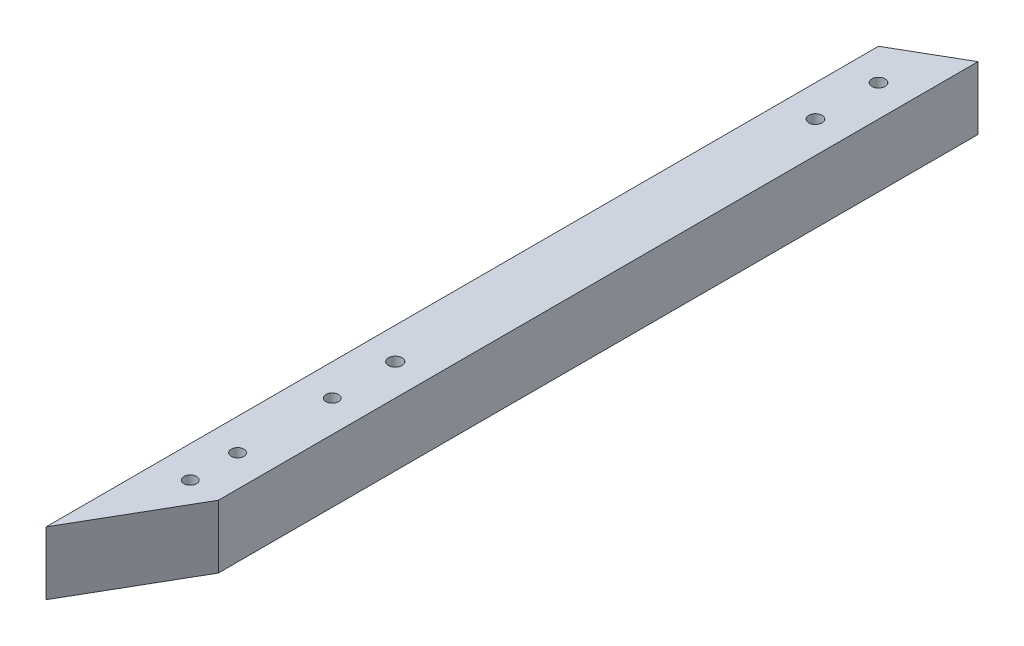
ISO-10303-21;
HEADER;
FILE_DESCRIPTION(('STEP AP214'),'2;1');
FILE_NAME('part.step','',(''),(''),'','','');
FILE_SCHEMA(('AUTOMOTIVE_DESIGN { 1 0 10303 214 1 1 1 1 }'));
ENDSEC;
DATA;
#1=APPLICATION_CONTEXT('core data for automotive mechanical design processes');
#2=APPLICATION_PROTOCOL_DEFINITION('international standard','automotive_design',2000,#1);
#3=PRODUCT_CONTEXT('',#1,'mechanical');
#4=PRODUCT('Part','Part','',(#3));
#5=PRODUCT_RELATED_PRODUCT_CATEGORY('part','',(#4));
#6=PRODUCT_DEFINITION_FORMATION('','',#4);
#7=PRODUCT_DEFINITION_CONTEXT('part definition',#1,'design');
#8=PRODUCT_DEFINITION('design','',#6,#7);
#9=PRODUCT_DEFINITION_SHAPE('','',#8);
#10=(LENGTH_UNIT() NAMED_UNIT(*) SI_UNIT(.MILLI.,.METRE.));
#11=(NAMED_UNIT(*) PLANE_ANGLE_UNIT() SI_UNIT($,.RADIAN.));
#12=(NAMED_UNIT(*) SI_UNIT($,.STERADIAN.) SOLID_ANGLE_UNIT());
#13=UNCERTAINTY_MEASURE_WITH_UNIT(LENGTH_MEASURE(1.E-05),#10,'distance_accuracy_value','');
#14=(GEOMETRIC_REPRESENTATION_CONTEXT(3) GLOBAL_UNCERTAINTY_ASSIGNED_CONTEXT((#13)) GLOBAL_UNIT_ASSIGNED_CONTEXT((#10,
#11,#12)) REPRESENTATION_CONTEXT('',''));
#15=CARTESIAN_POINT('',(0.,0.,0.));
#16=DIRECTION('',(0.,0.,1.));
#17=DIRECTION('',(1.,0.,0.));
#18=AXIS2_PLACEMENT_3D('',#15,#16,#17);
#19=CARTESIAN_POINT('',(0.,0.,275.47));
#20=DIRECTION('',(1.,0.,0.));
#21=DIRECTION('',(0.,0.,-1.));
#22=AXIS2_PLACEMENT_3D('',#19,#20,#21);
#23=PLANE('',#22);
#24=DIRECTION('',(0.,0.,-1.));
#25=VECTOR('',#24,1.);
#26=CARTESIAN_POINT('',(0.,20.,275.47));
#27=LINE('',#26,#25);
#28=CARTESIAN_POINT('',(0.,20.,275.47));
#29=VERTEX_POINT('',#28);
#30=CARTESIAN_POINT('',(0.,20.,11.5470053837927));
#31=VERTEX_POINT('',#30);
#32=EDGE_CURVE('E90',#29,#31,#27,.T.);
#33=ORIENTED_EDGE('',*,*,#32,.T.);
#34=DIRECTION('',(0.,1.,0.));
#35=VECTOR('',#34,1.);
#36=CARTESIAN_POINT('',(0.,-243.92,11.5470053837927));
#37=LINE('',#36,#35);
#38=CARTESIAN_POINT('',(0.,0.,11.5470053837927));
#39=VERTEX_POINT('',#38);
#40=EDGE_CURVE('E92',#39,#31,#37,.T.);
#41=ORIENTED_EDGE('',*,*,#40,.F.);
#42=DIRECTION('',(0.,0.,-1.));
#43=VECTOR('',#42,1.);
#44=CARTESIAN_POINT('',(0.,0.,275.47));
#45=LINE('',#44,#43);
#46=CARTESIAN_POINT('',(0.,0.,275.47));
#47=VERTEX_POINT('',#46);
#48=EDGE_CURVE('E11',#47,#39,#45,.T.);
#49=ORIENTED_EDGE('',*,*,#48,.F.);
#50=DIRECTION('',(0.,-1.,0.));
#51=VECTOR('',#50,1.);
#52=CARTESIAN_POINT('',(0.,0.,275.47));
#53=LINE('',#52,#51);
#54=EDGE_CURVE('E98',#29,#47,#53,.T.);
#55=ORIENTED_EDGE('',*,*,#54,.F.);
#56=EDGE_LOOP('',(#33,#41,#49,#55));
#57=FACE_BOUND('',#56,.T.);
#58=ADVANCED_FACE('F37',(#57),#23,.F.);
#59=CARTESIAN_POINT('',(0.,0.,275.47));
#60=DIRECTION('',(0.,1.,0.));
#61=DIRECTION('',(0.,0.,1.));
#62=AXIS2_PLACEMENT_3D('',#59,#60,#61);
#63=PLANE('',#62);
#64=CARTESIAN_POINT('',(10.,0.,21.5470053837927));
#65=DIRECTION('',(0.,-1.,0.));
#66=DIRECTION('',(0.,0.,-1.));
#67=AXIS2_PLACEMENT_3D('',#64,#65,#66);
#68=CIRCLE('',#67,2.1);
#69=CARTESIAN_POINT('',(10.,0.,19.4470053837927));
#70=VERTEX_POINT('',#69);
#71=EDGE_CURVE('E103',#70,#70,#68,.T.);
#72=ORIENTED_EDGE('',*,*,#71,.F.);
#73=EDGE_LOOP('',(#72));
#74=FACE_BOUND('',#73,.T.);
#75=CARTESIAN_POINT('',(10.,0.,41.5470053837927));
#76=DIRECTION('',(0.,-1.,0.));
#77=DIRECTION('',(0.,0.,-1.));
#78=AXIS2_PLACEMENT_3D('',#75,#76,#77);
#79=CIRCLE('',#78,2.1);
#80=CARTESIAN_POINT('',(10.,0.,39.4470053837927));
#81=VERTEX_POINT('',#80);
#82=EDGE_CURVE('E109',#81,#81,#79,.T.);
#83=ORIENTED_EDGE('',*,*,#82,.F.);
#84=EDGE_LOOP('',(#83));
#85=FACE_BOUND('',#84,.T.);
#86=CARTESIAN_POINT('',(9.99999999999997,0.,239.74));
#87=DIRECTION('',(0.,-1.,0.));
#88=DIRECTION('',(0.,0.,-1.));
#89=AXIS2_PLACEMENT_3D('',#86,#87,#88);
#90=CIRCLE('',#89,2.);
#91=CARTESIAN_POINT('',(9.99999999999997,0.,237.74));
#92=VERTEX_POINT('',#91);
#93=EDGE_CURVE('E120',#92,#92,#90,.T.);
#94=ORIENTED_EDGE('',*,*,#93,.F.);
#95=EDGE_LOOP('',(#94));
#96=FACE_BOUND('',#95,.T.);
#97=CARTESIAN_POINT('',(9.99999999999997,0.,224.74));
#98=DIRECTION('',(0.,-1.,0.));
#99=DIRECTION('',(0.,0.,-1.));
#100=AXIS2_PLACEMENT_3D('',#97,#98,#99);
#101=CIRCLE('',#100,2.);
#102=CARTESIAN_POINT('',(9.99999999999997,0.,222.74));
#103=VERTEX_POINT('',#102);
#104=EDGE_CURVE('E126',#103,#103,#101,.T.);
#105=ORIENTED_EDGE('',*,*,#104,.F.);
#106=EDGE_LOOP('',(#105));
#107=FACE_BOUND('',#106,.T.);
#108=CARTESIAN_POINT('',(9.99999999999998,0.,194.74));
#109=DIRECTION('',(0.,-1.,0.));
#110=DIRECTION('',(0.,0.,-1.));
#111=AXIS2_PLACEMENT_3D('',#108,#109,#110);
#112=CIRCLE('',#111,2.);
#113=CARTESIAN_POINT('',(9.99999999999998,0.,192.74));
#114=VERTEX_POINT('',#113);
#115=EDGE_CURVE('E132',#114,#114,#112,.T.);
#116=ORIENTED_EDGE('',*,*,#115,.F.);
#117=EDGE_LOOP('',(#116));
#118=FACE_BOUND('',#117,.T.);
#119=CARTESIAN_POINT('',(9.99999999999998,0.,174.74));
#120=DIRECTION('',(0.,-1.,0.));
#121=DIRECTION('',(0.,0.,-1.));
#122=AXIS2_PLACEMENT_3D('',#119,#120,#121);
#123=CIRCLE('',#122,2.15000000000001);
#124=CARTESIAN_POINT('',(9.99999999999998,0.,172.59));
#125=VERTEX_POINT('',#124);
#126=EDGE_CURVE('E107',#125,#125,#123,.T.);
#127=ORIENTED_EDGE('',*,*,#126,.F.);
#128=EDGE_LOOP('',(#127));
#129=FACE_BOUND('',#128,.T.);
#130=DIRECTION('',(0.,0.,-1.));
#131=VECTOR('',#130,1.);
#132=CARTESIAN_POINT('',(20.,0.,275.47));
#133=LINE('',#132,#131);
#134=CARTESIAN_POINT('',(20.,0.,240.828983848623));
#135=VERTEX_POINT('',#134);
#136=CARTESIAN_POINT('',(20.,0.,0.));
#137=VERTEX_POINT('',#136);
#138=EDGE_CURVE('E46',#135,#137,#133,.T.);
#139=ORIENTED_EDGE('',*,*,#138,.F.);
#140=DIRECTION('',(-0.500000000000004,0.,0.866025403784436));
#141=VECTOR('',#140,1.);
#142=CARTESIAN_POINT('',(0.,0.,275.47));
#143=LINE('',#142,#141);
#144=EDGE_CURVE('E76',#135,#47,#143,.T.);
#145=ORIENTED_EDGE('',*,*,#144,.T.);
#146=ORIENTED_EDGE('',*,*,#48,.T.);
#147=DIRECTION('',(0.866025403784436,0.,-0.500000000000005));
#148=VECTOR('',#147,1.);
#149=CARTESIAN_POINT('',(-114.28200899025,0.,77.5277540378457));
#150=LINE('',#149,#148);
#151=EDGE_CURVE('E81',#39,#137,#150,.T.);
#152=ORIENTED_EDGE('',*,*,#151,.T.);
#153=EDGE_LOOP('',(#139,#145,#146,#152));
#154=FACE_BOUND('',#153,.T.);
#155=ADVANCED_FACE('F148',(#74,#85,#96,#107,#118,#129,#154),#63,.F.);
#156=CARTESIAN_POINT('',(20.,0.,275.47));
#157=DIRECTION('',(-1.,0.,0.));
#158=DIRECTION('',(0.,0.,1.));
#159=AXIS2_PLACEMENT_3D('',#156,#157,#158);
#160=PLANE('',#159);
#161=DIRECTION('',(0.,0.,-1.));
#162=VECTOR('',#161,1.);
#163=CARTESIAN_POINT('',(20.,20.,275.47));
#164=LINE('',#163,#162);
#165=CARTESIAN_POINT('',(20.,20.,240.828983848623));
#166=VERTEX_POINT('',#165);
#167=CARTESIAN_POINT('',(20.,20.,0.));
#168=VERTEX_POINT('',#167);
#169=EDGE_CURVE('E87',#166,#168,#164,.T.);
#170=ORIENTED_EDGE('',*,*,#169,.F.);
#171=DIRECTION('',(0.,1.,0.));
#172=VECTOR('',#171,1.);
#173=CARTESIAN_POINT('',(20.,-243.92,240.828983848623));
#174=LINE('',#173,#172);
#175=EDGE_CURVE('E73',#135,#166,#174,.T.);
#176=ORIENTED_EDGE('',*,*,#175,.F.);
#177=ORIENTED_EDGE('',*,*,#138,.T.);
#178=DIRECTION('',(0.,1.,0.));
#179=VECTOR('',#178,1.);
#180=CARTESIAN_POINT('',(20.,0.,0.));
#181=LINE('',#180,#179);
#182=EDGE_CURVE('E95',#137,#168,#181,.T.);
#183=ORIENTED_EDGE('',*,*,#182,.T.);
#184=EDGE_LOOP('',(#170,#176,#177,#183));
#185=FACE_BOUND('',#184,.T.);
#186=ADVANCED_FACE('F94',(#185),#160,.F.);
#187=CARTESIAN_POINT('',(0.,20.,275.47));
#188=DIRECTION('',(0.,-1.,0.));
#189=DIRECTION('',(0.,0.,-1.));
#190=AXIS2_PLACEMENT_3D('',#187,#188,#189);
#191=PLANE('',#190);
#192=CARTESIAN_POINT('',(10.,20.,21.5470053837927));
#193=DIRECTION('',(0.,-1.,0.));
#194=DIRECTION('',(0.,0.,-1.));
#195=AXIS2_PLACEMENT_3D('',#192,#193,#194);
#196=CIRCLE('',#195,2.1);
#197=CARTESIAN_POINT('',(10.,20.,19.4470053837927));
#198=VERTEX_POINT('',#197);
#199=EDGE_CURVE('E40',#198,#198,#196,.T.);
#200=ORIENTED_EDGE('',*,*,#199,.T.);
#201=EDGE_LOOP('',(#200));
#202=FACE_BOUND('',#201,.T.);
#203=CARTESIAN_POINT('',(10.,20.,41.5470053837927));
#204=DIRECTION('',(0.,-1.,0.));
#205=DIRECTION('',(0.,0.,-1.));
#206=AXIS2_PLACEMENT_3D('',#203,#204,#205);
#207=CIRCLE('',#206,2.1);
#208=CARTESIAN_POINT('',(10.,20.,39.4470053837927));
#209=VERTEX_POINT('',#208);
#210=EDGE_CURVE('E101',#209,#209,#207,.T.);
#211=ORIENTED_EDGE('',*,*,#210,.T.);
#212=EDGE_LOOP('',(#211));
#213=FACE_BOUND('',#212,.T.);
#214=CARTESIAN_POINT('',(9.99999999999997,20.,239.74));
#215=DIRECTION('',(0.,-1.,0.));
#216=DIRECTION('',(0.,0.,-1.));
#217=AXIS2_PLACEMENT_3D('',#214,#215,#216);
#218=CIRCLE('',#217,2.);
#219=CARTESIAN_POINT('',(9.99999999999997,20.,237.74));
#220=VERTEX_POINT('',#219);
#221=EDGE_CURVE('E116',#220,#220,#218,.T.);
#222=ORIENTED_EDGE('',*,*,#221,.T.);
#223=EDGE_LOOP('',(#222));
#224=FACE_BOUND('',#223,.T.);
#225=CARTESIAN_POINT('',(9.99999999999997,20.,224.74));
#226=DIRECTION('',(0.,-1.,0.));
#227=DIRECTION('',(0.,0.,-1.));
#228=AXIS2_PLACEMENT_3D('',#225,#226,#227);
#229=CIRCLE('',#228,2.);
#230=CARTESIAN_POINT('',(9.99999999999997,20.,222.74));
#231=VERTEX_POINT('',#230);
#232=EDGE_CURVE('E123',#231,#231,#229,.T.);
#233=ORIENTED_EDGE('',*,*,#232,.T.);
#234=EDGE_LOOP('',(#233));
#235=FACE_BOUND('',#234,.T.);
#236=CARTESIAN_POINT('',(9.99999999999998,20.,194.74));
#237=DIRECTION('',(0.,-1.,0.));
#238=DIRECTION('',(0.,0.,-1.));
#239=AXIS2_PLACEMENT_3D('',#236,#237,#238);
#240=CIRCLE('',#239,2.);
#241=CARTESIAN_POINT('',(9.99999999999998,20.,192.74));
#242=VERTEX_POINT('',#241);
#243=EDGE_CURVE('E129',#242,#242,#240,.T.);
#244=ORIENTED_EDGE('',*,*,#243,.T.);
#245=EDGE_LOOP('',(#244));
#246=FACE_BOUND('',#245,.T.);
#247=CARTESIAN_POINT('',(9.99999999999998,20.,174.74));
#248=DIRECTION('',(0.,-1.,0.));
#249=DIRECTION('',(0.,0.,-1.));
#250=AXIS2_PLACEMENT_3D('',#247,#248,#249);
#251=CIRCLE('',#250,2.15000000000001);
#252=CARTESIAN_POINT('',(9.99999999999998,20.,172.59));
#253=VERTEX_POINT('',#252);
#254=EDGE_CURVE('E135',#253,#253,#251,.T.);
#255=ORIENTED_EDGE('',*,*,#254,.T.);
#256=EDGE_LOOP('',(#255));
#257=FACE_BOUND('',#256,.T.);
#258=ORIENTED_EDGE('',*,*,#32,.F.);
#259=DIRECTION('',(-0.500000000000004,0.,0.866025403784436));
#260=VECTOR('',#259,1.);
#261=CARTESIAN_POINT('',(0.,20.,275.47));
#262=LINE('',#261,#260);
#263=EDGE_CURVE('E53',#166,#29,#262,.T.);
#264=ORIENTED_EDGE('',*,*,#263,.F.);
#265=ORIENTED_EDGE('',*,*,#169,.T.);
#266=DIRECTION('',(0.866025403784436,0.,-0.500000000000005));
#267=VECTOR('',#266,1.);
#268=CARTESIAN_POINT('',(20.,20.,0.));
#269=LINE('',#268,#267);
#270=EDGE_CURVE('E119',#31,#168,#269,.T.);
#271=ORIENTED_EDGE('',*,*,#270,.F.);
#272=EDGE_LOOP('',(#258,#264,#265,#271));
#273=FACE_BOUND('',#272,.T.);
#274=ADVANCED_FACE('F85',(#202,#213,#224,#235,#246,#257,#273),#191,.F.);
#275=CARTESIAN_POINT('',(20.,-243.92,0.));
#276=DIRECTION('',(0.500000000000005,0.,0.866025403784436));
#277=DIRECTION('',(0.866025403784436,0.,-0.500000000000005));
#278=AXIS2_PLACEMENT_3D('',#275,#276,#277);
#279=PLANE('',#278);
#280=ORIENTED_EDGE('',*,*,#40,.T.);
#281=ORIENTED_EDGE('',*,*,#270,.T.);
#282=ORIENTED_EDGE('',*,*,#182,.F.);
#283=ORIENTED_EDGE('',*,*,#151,.F.);
#284=EDGE_LOOP('',(#280,#281,#282,#283));
#285=FACE_BOUND('',#284,.T.);
#286=ADVANCED_FACE('F151',(#285),#279,.F.);
#287=CARTESIAN_POINT('',(0.,-243.92,275.47));
#288=DIRECTION('',(-0.866025403784436,0.,-0.500000000000004));
#289=DIRECTION('',(-0.500000000000004,0.,0.866025403784436));
#290=AXIS2_PLACEMENT_3D('',#287,#288,#289);
#291=PLANE('',#290);
#292=ORIENTED_EDGE('',*,*,#175,.T.);
#293=ORIENTED_EDGE('',*,*,#263,.T.);
#294=ORIENTED_EDGE('',*,*,#54,.T.);
#295=ORIENTED_EDGE('',*,*,#144,.F.);
#296=EDGE_LOOP('',(#292,#293,#294,#295));
#297=FACE_BOUND('',#296,.T.);
#298=ADVANCED_FACE('F74',(#297),#291,.F.);
#299=CARTESIAN_POINT('',(9.99999999999998,20.,174.74));
#300=DIRECTION('',(0.,-1.,0.));
#301=DIRECTION('',(0.,0.,-1.));
#302=AXIS2_PLACEMENT_3D('',#299,#300,#301);
#303=CYLINDRICAL_SURFACE('',#302,2.15000000000001);
#304=ORIENTED_EDGE('',*,*,#254,.F.);
#305=EDGE_LOOP('',(#304));
#306=FACE_BOUND('',#305,.T.);
#307=ORIENTED_EDGE('',*,*,#126,.T.);
#308=EDGE_LOOP('',(#307));
#309=FACE_BOUND('',#308,.T.);
#310=ADVANCED_FACE('F158',(#306,#309),#303,.F.);
#311=CARTESIAN_POINT('',(9.99999999999998,20.,194.74));
#312=DIRECTION('',(0.,-1.,0.));
#313=DIRECTION('',(0.,0.,-1.));
#314=AXIS2_PLACEMENT_3D('',#311,#312,#313);
#315=CYLINDRICAL_SURFACE('',#314,2.);
#316=ORIENTED_EDGE('',*,*,#243,.F.);
#317=EDGE_LOOP('',(#316));
#318=FACE_BOUND('',#317,.T.);
#319=ORIENTED_EDGE('',*,*,#115,.T.);
#320=EDGE_LOOP('',(#319));
#321=FACE_BOUND('',#320,.T.);
#322=ADVANCED_FACE('F183',(#318,#321),#315,.F.);
#323=CARTESIAN_POINT('',(9.99999999999997,20.,224.74));
#324=DIRECTION('',(0.,-1.,0.));
#325=DIRECTION('',(0.,0.,-1.));
#326=AXIS2_PLACEMENT_3D('',#323,#324,#325);
#327=CYLINDRICAL_SURFACE('',#326,2.);
#328=ORIENTED_EDGE('',*,*,#232,.F.);
#329=EDGE_LOOP('',(#328));
#330=FACE_BOUND('',#329,.T.);
#331=ORIENTED_EDGE('',*,*,#104,.T.);
#332=EDGE_LOOP('',(#331));
#333=FACE_BOUND('',#332,.T.);
#334=ADVANCED_FACE('F189',(#330,#333),#327,.F.);
#335=CARTESIAN_POINT('',(9.99999999999997,20.,239.74));
#336=DIRECTION('',(0.,-1.,0.));
#337=DIRECTION('',(0.,0.,-1.));
#338=AXIS2_PLACEMENT_3D('',#335,#336,#337);
#339=CYLINDRICAL_SURFACE('',#338,2.);
#340=ORIENTED_EDGE('',*,*,#221,.F.);
#341=EDGE_LOOP('',(#340));
#342=FACE_BOUND('',#341,.T.);
#343=ORIENTED_EDGE('',*,*,#93,.T.);
#344=EDGE_LOOP('',(#343));
#345=FACE_BOUND('',#344,.T.);
#346=ADVANCED_FACE('F196',(#342,#345),#339,.F.);
#347=CARTESIAN_POINT('',(10.,60.,41.5470053837927));
#348=DIRECTION('',(0.,-1.,0.));
#349=DIRECTION('',(0.,0.,-1.));
#350=AXIS2_PLACEMENT_3D('',#347,#348,#349);
#351=CYLINDRICAL_SURFACE('',#350,2.1);
#352=CARTESIAN_POINT('',(10.,0.,39.4470053837927));
#353=CARTESIAN_POINT('',(10.,0.208333333333334,39.4470053837927));
#354=CARTESIAN_POINT('',(10.,0.416666666666667,39.4470053837927));
#355=CARTESIAN_POINT('',(10.,0.833333333333334,39.4470053837927));
#356=CARTESIAN_POINT('',(10.,1.04166666666667,39.4470053837927));
#357=CARTESIAN_POINT('',(10.,1.45833333333333,39.4470053837927));
#358=CARTESIAN_POINT('',(10.,1.66666666666667,39.4470053837927));
#359=CARTESIAN_POINT('',(10.,2.08333333333334,39.4470053837927));
#360=CARTESIAN_POINT('',(10.,2.29166666666667,39.4470053837927));
#361=CARTESIAN_POINT('',(10.,2.70833333333334,39.4470053837927));
#362=CARTESIAN_POINT('',(10.,2.91666666666667,39.4470053837927));
#363=CARTESIAN_POINT('',(10.,3.33333333333334,39.4470053837927));
#364=CARTESIAN_POINT('',(10.,3.54166666666667,39.4470053837927));
#365=CARTESIAN_POINT('',(10.,3.95833333333334,39.4470053837927));
#366=CARTESIAN_POINT('',(10.,4.16666666666667,39.4470053837927));
#367=CARTESIAN_POINT('',(10.,4.58333333333334,39.4470053837927));
#368=CARTESIAN_POINT('',(10.,4.79166666666667,39.4470053837927));
#369=CARTESIAN_POINT('',(10.,5.20833333333334,39.4470053837927));
#370=CARTESIAN_POINT('',(10.,5.41666666666667,39.4470053837927));
#371=CARTESIAN_POINT('',(10.,5.83333333333334,39.4470053837927));
#372=CARTESIAN_POINT('',(10.,6.04166666666667,39.4470053837927));
#373=CARTESIAN_POINT('',(10.,6.45833333333333,39.4470053837927));
#374=CARTESIAN_POINT('',(10.,6.66666666666667,39.4470053837927));
#375=CARTESIAN_POINT('',(10.,7.08333333333333,39.4470053837927));
#376=CARTESIAN_POINT('',(10.,7.29166666666667,39.4470053837927));
#377=CARTESIAN_POINT('',(10.,7.70833333333333,39.4470053837927));
#378=CARTESIAN_POINT('',(10.,7.91666666666667,39.4470053837927));
#379=CARTESIAN_POINT('',(10.,8.33333333333333,39.4470053837927));
#380=CARTESIAN_POINT('',(10.,8.54166666666667,39.4470053837927));
#381=CARTESIAN_POINT('',(10.,8.95833333333333,39.4470053837927));
#382=CARTESIAN_POINT('',(10.,9.16666666666667,39.4470053837927));
#383=CARTESIAN_POINT('',(10.,9.58333333333333,39.4470053837927));
#384=CARTESIAN_POINT('',(10.,9.79166666666667,39.4470053837927));
#385=CARTESIAN_POINT('',(10.,10.2083333333333,39.4470053837927));
#386=CARTESIAN_POINT('',(10.,10.4166666666667,39.4470053837927));
#387=CARTESIAN_POINT('',(10.,10.8333333333333,39.4470053837927));
#388=CARTESIAN_POINT('',(10.,11.0416666666667,39.4470053837927));
#389=CARTESIAN_POINT('',(10.,11.4583333333333,39.4470053837927));
#390=CARTESIAN_POINT('',(10.,11.6666666666667,39.4470053837927));
#391=CARTESIAN_POINT('',(10.,12.0833333333333,39.4470053837927));
#392=CARTESIAN_POINT('',(10.,12.2916666666667,39.4470053837927));
#393=CARTESIAN_POINT('',(10.,12.7083333333333,39.4470053837927));
#394=CARTESIAN_POINT('',(10.,12.9166666666667,39.4470053837927));
#395=CARTESIAN_POINT('',(10.,13.3333333333333,39.4470053837927));
#396=CARTESIAN_POINT('',(10.,13.5416666666667,39.4470053837927));
#397=CARTESIAN_POINT('',(10.,13.9583333333333,39.4470053837927));
#398=CARTESIAN_POINT('',(10.,14.1666666666667,39.4470053837927));
#399=CARTESIAN_POINT('',(10.,14.5833333333333,39.4470053837927));
#400=CARTESIAN_POINT('',(10.,14.7916666666667,39.4470053837927));
#401=CARTESIAN_POINT('',(10.,15.2083333333333,39.4470053837927));
#402=CARTESIAN_POINT('',(10.,15.4166666666667,39.4470053837927));
#403=CARTESIAN_POINT('',(10.,15.8333333333333,39.4470053837927));
#404=CARTESIAN_POINT('',(10.,16.0416666666667,39.4470053837927));
#405=CARTESIAN_POINT('',(10.,16.4583333333333,39.4470053837927));
#406=CARTESIAN_POINT('',(10.,16.6666666666667,39.4470053837927));
#407=CARTESIAN_POINT('',(10.,17.0833333333333,39.4470053837927));
#408=CARTESIAN_POINT('',(10.,17.2916666666667,39.4470053837927));
#409=CARTESIAN_POINT('',(10.,17.7083333333333,39.4470053837927));
#410=CARTESIAN_POINT('',(10.,17.9166666666667,39.4470053837927));
#411=CARTESIAN_POINT('',(10.,18.3333333333333,39.4470053837927));
#412=CARTESIAN_POINT('',(10.,18.5416666666667,39.4470053837927));
#413=CARTESIAN_POINT('',(10.,18.9583333333333,39.4470053837927));
#414=CARTESIAN_POINT('',(10.,19.1666666666667,39.4470053837927));
#415=CARTESIAN_POINT('',(10.,19.5833333333333,39.4470053837927));
#416=CARTESIAN_POINT('',(10.,19.7916666666667,39.4470053837927));
#417=CARTESIAN_POINT('',(10.,20.,39.4470053837927));
#418=B_SPLINE_CURVE_WITH_KNOTS('',3,(#352,#353,#354,#355,#356,#357,#358,#359,#360,#361,#362,
#363,#364,#365,#366,#367,#368,#369,#370,#371,#372,#373,#374,#375,#376,#377,#378,#379,#380,#381,
#382,#383,#384,#385,#386,#387,#388,#389,#390,#391,#392,#393,#394,#395,#396,#397,#398,#399,#400,
#401,#402,#403,#404,#405,#406,#407,#408,#409,#410,#411,#412,#413,#414,#415,#416,#417),
.UNSPECIFIED.,.F.,.F.,(4,2,2,2,2,2,2,2,2,2,2,2,2,2,2,2,2,2,2,2,2,2,2,2,2,2,2,2,2,2,2,2,4),(0.,
0.625000000000001,1.25,1.875,2.5,3.125,3.75,4.375,5.,5.62500000000001,6.25,6.875,7.5,8.125,8.75,
9.375,10.,10.625,11.25,11.875,12.5,13.125,13.75,14.375,15.,15.625,16.25,16.875,17.5,18.125,
18.75,19.375,20.),.UNSPECIFIED.);
#419=EDGE_CURVE('BSEAM200',#81,#209,#418,.T.);
#420=ORIENTED_EDGE('',*,*,#82,.T.);
#421=ORIENTED_EDGE('',*,*,#210,.F.);
#422=ORIENTED_EDGE('',*,*,#419,.T.);
#423=ORIENTED_EDGE('',*,*,#419,.F.);
#424=EDGE_LOOP('',(#420,#422,#421,#423));
#425=FACE_BOUND('',#424,.T.);
#426=ADVANCED_FACE('F200',(#425),#351,.F.);
#427=CARTESIAN_POINT('',(10.,60.,21.5470053837927));
#428=DIRECTION('',(0.,-1.,0.));
#429=DIRECTION('',(0.,0.,-1.));
#430=AXIS2_PLACEMENT_3D('',#427,#428,#429);
#431=CYLINDRICAL_SURFACE('',#430,2.1);
#432=CARTESIAN_POINT('',(10.,0.,19.4470053837927));
#433=CARTESIAN_POINT('',(10.,0.208333333333334,19.4470053837927));
#434=CARTESIAN_POINT('',(10.,0.416666666666667,19.4470053837927));
#435=CARTESIAN_POINT('',(10.,0.833333333333334,19.4470053837927));
#436=CARTESIAN_POINT('',(10.,1.04166666666667,19.4470053837927));
#437=CARTESIAN_POINT('',(10.,1.45833333333333,19.4470053837927));
#438=CARTESIAN_POINT('',(10.,1.66666666666667,19.4470053837927));
#439=CARTESIAN_POINT('',(10.,2.08333333333334,19.4470053837927));
#440=CARTESIAN_POINT('',(10.,2.29166666666667,19.4470053837927));
#441=CARTESIAN_POINT('',(10.,2.70833333333334,19.4470053837927));
#442=CARTESIAN_POINT('',(10.,2.91666666666667,19.4470053837927));
#443=CARTESIAN_POINT('',(10.,3.33333333333334,19.4470053837927));
#444=CARTESIAN_POINT('',(10.,3.54166666666667,19.4470053837927));
#445=CARTESIAN_POINT('',(10.,3.95833333333334,19.4470053837927));
#446=CARTESIAN_POINT('',(10.,4.16666666666667,19.4470053837927));
#447=CARTESIAN_POINT('',(10.,4.58333333333334,19.4470053837927));
#448=CARTESIAN_POINT('',(10.,4.79166666666667,19.4470053837927));
#449=CARTESIAN_POINT('',(10.,5.20833333333334,19.4470053837927));
#450=CARTESIAN_POINT('',(10.,5.41666666666667,19.4470053837927));
#451=CARTESIAN_POINT('',(10.,5.83333333333334,19.4470053837927));
#452=CARTESIAN_POINT('',(10.,6.04166666666667,19.4470053837927));
#453=CARTESIAN_POINT('',(10.,6.45833333333333,19.4470053837927));
#454=CARTESIAN_POINT('',(10.,6.66666666666667,19.4470053837927));
#455=CARTESIAN_POINT('',(10.,7.08333333333333,19.4470053837927));
#456=CARTESIAN_POINT('',(10.,7.29166666666667,19.4470053837927));
#457=CARTESIAN_POINT('',(10.,7.70833333333333,19.4470053837927));
#458=CARTESIAN_POINT('',(10.,7.91666666666667,19.4470053837927));
#459=CARTESIAN_POINT('',(10.,8.33333333333333,19.4470053837927));
#460=CARTESIAN_POINT('',(10.,8.54166666666667,19.4470053837927));
#461=CARTESIAN_POINT('',(10.,8.95833333333333,19.4470053837927));
#462=CARTESIAN_POINT('',(10.,9.16666666666667,19.4470053837927));
#463=CARTESIAN_POINT('',(10.,9.58333333333333,19.4470053837927));
#464=CARTESIAN_POINT('',(10.,9.79166666666667,19.4470053837927));
#465=CARTESIAN_POINT('',(10.,10.2083333333333,19.4470053837927));
#466=CARTESIAN_POINT('',(10.,10.4166666666667,19.4470053837927));
#467=CARTESIAN_POINT('',(10.,10.8333333333333,19.4470053837927));
#468=CARTESIAN_POINT('',(10.,11.0416666666667,19.4470053837927));
#469=CARTESIAN_POINT('',(10.,11.4583333333333,19.4470053837927));
#470=CARTESIAN_POINT('',(10.,11.6666666666667,19.4470053837927));
#471=CARTESIAN_POINT('',(10.,12.0833333333333,19.4470053837927));
#472=CARTESIAN_POINT('',(10.,12.2916666666667,19.4470053837927));
#473=CARTESIAN_POINT('',(10.,12.7083333333333,19.4470053837927));
#474=CARTESIAN_POINT('',(10.,12.9166666666667,19.4470053837927));
#475=CARTESIAN_POINT('',(10.,13.3333333333333,19.4470053837927));
#476=CARTESIAN_POINT('',(10.,13.5416666666667,19.4470053837927));
#477=CARTESIAN_POINT('',(10.,13.9583333333333,19.4470053837927));
#478=CARTESIAN_POINT('',(10.,14.1666666666667,19.4470053837927));
#479=CARTESIAN_POINT('',(10.,14.5833333333333,19.4470053837927));
#480=CARTESIAN_POINT('',(10.,14.7916666666667,19.4470053837927));
#481=CARTESIAN_POINT('',(10.,15.2083333333333,19.4470053837927));
#482=CARTESIAN_POINT('',(10.,15.4166666666667,19.4470053837927));
#483=CARTESIAN_POINT('',(10.,15.8333333333333,19.4470053837927));
#484=CARTESIAN_POINT('',(10.,16.0416666666667,19.4470053837927));
#485=CARTESIAN_POINT('',(10.,16.4583333333333,19.4470053837927));
#486=CARTESIAN_POINT('',(10.,16.6666666666667,19.4470053837927));
#487=CARTESIAN_POINT('',(10.,17.0833333333333,19.4470053837927));
#488=CARTESIAN_POINT('',(10.,17.2916666666667,19.4470053837927));
#489=CARTESIAN_POINT('',(10.,17.7083333333333,19.4470053837927));
#490=CARTESIAN_POINT('',(10.,17.9166666666667,19.4470053837927));
#491=CARTESIAN_POINT('',(10.,18.3333333333333,19.4470053837927));
#492=CARTESIAN_POINT('',(10.,18.5416666666667,19.4470053837927));
#493=CARTESIAN_POINT('',(10.,18.9583333333333,19.4470053837927));
#494=CARTESIAN_POINT('',(10.,19.1666666666667,19.4470053837927));
#495=CARTESIAN_POINT('',(10.,19.5833333333333,19.4470053837927));
#496=CARTESIAN_POINT('',(10.,19.7916666666667,19.4470053837927));
#497=CARTESIAN_POINT('',(10.,20.,19.4470053837927));
#498=B_SPLINE_CURVE_WITH_KNOTS('',3,(#432,#433,#434,#435,#436,#437,#438,#439,#440,#441,#442,
#443,#444,#445,#446,#447,#448,#449,#450,#451,#452,#453,#454,#455,#456,#457,#458,#459,#460,#461,
#462,#463,#464,#465,#466,#467,#468,#469,#470,#471,#472,#473,#474,#475,#476,#477,#478,#479,#480,
#481,#482,#483,#484,#485,#486,#487,#488,#489,#490,#491,#492,#493,#494,#495,#496,#497),
.UNSPECIFIED.,.F.,.F.,(4,2,2,2,2,2,2,2,2,2,2,2,2,2,2,2,2,2,2,2,2,2,2,2,2,2,2,2,2,2,2,2,4),(0.,
0.625000000000001,1.25,1.875,2.5,3.125,3.75,4.375,5.,5.62500000000001,6.25,6.875,7.5,8.125,8.75,
9.375,10.,10.625,11.25,11.875,12.5,13.125,13.75,14.375,15.,15.625,16.25,16.875,17.5,18.125,
18.75,19.375,20.),.UNSPECIFIED.);
#499=EDGE_CURVE('BSEAM204',#70,#198,#498,.T.);
#500=ORIENTED_EDGE('',*,*,#71,.T.);
#501=ORIENTED_EDGE('',*,*,#199,.F.);
#502=ORIENTED_EDGE('',*,*,#499,.T.);
#503=ORIENTED_EDGE('',*,*,#499,.F.);
#504=EDGE_LOOP('',(#500,#502,#501,#503));
#505=FACE_BOUND('',#504,.T.);
#506=ADVANCED_FACE('F204',(#505),#431,.F.);
#507=CLOSED_SHELL('',(#58,#155,#186,#274,#286,#298,#310,#322,#334,#346,#426,#506));
#508=MANIFOLD_SOLID_BREP('B2',#507);
#509=ADVANCED_BREP_SHAPE_REPRESENTATION('',(#18,#508),#14);
#510=SHAPE_DEFINITION_REPRESENTATION(#9,#509);
ENDSEC;
END-ISO-10303-21;
